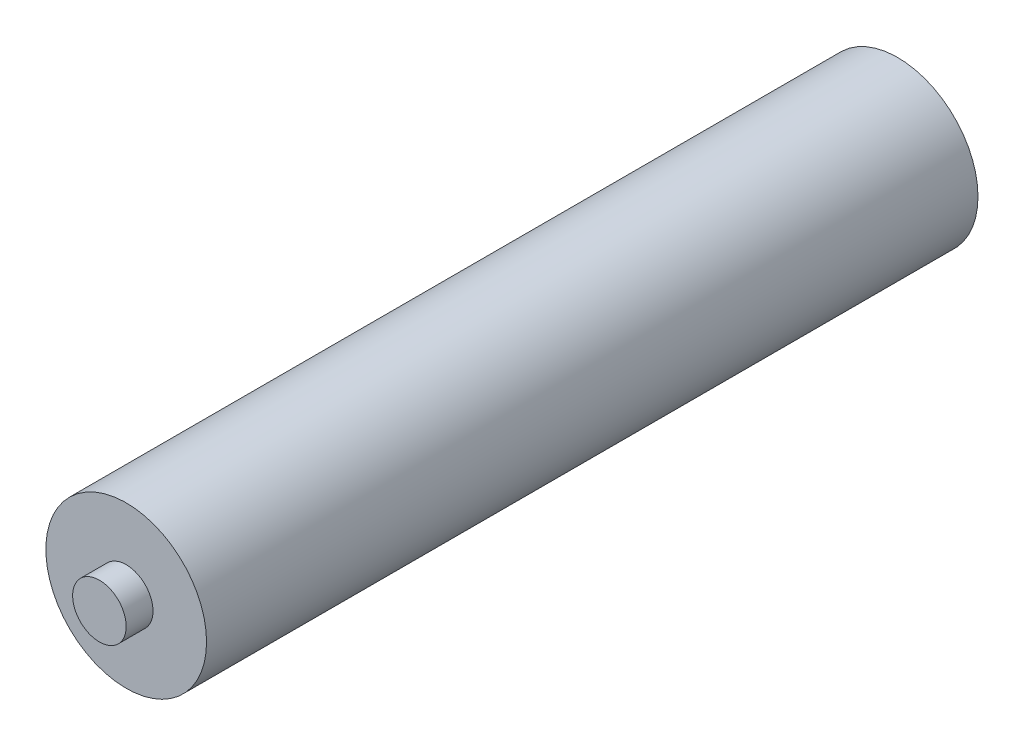
ISO-10303-21;
HEADER;
FILE_DESCRIPTION(('STEP AP214'),'2;1');
FILE_NAME('part.step','',(''),(''),'','','');
FILE_SCHEMA(('AUTOMOTIVE_DESIGN { 1 0 10303 214 1 1 1 1 }'));
ENDSEC;
DATA;
#1=APPLICATION_CONTEXT('core data for automotive mechanical design processes');
#2=APPLICATION_PROTOCOL_DEFINITION('international standard','automotive_design',2000,#1);
#3=PRODUCT_CONTEXT('',#1,'mechanical');
#4=PRODUCT('Part','Part','',(#3));
#5=PRODUCT_RELATED_PRODUCT_CATEGORY('part','',(#4));
#6=PRODUCT_DEFINITION_FORMATION('','',#4);
#7=PRODUCT_DEFINITION_CONTEXT('part definition',#1,'design');
#8=PRODUCT_DEFINITION('design','',#6,#7);
#9=PRODUCT_DEFINITION_SHAPE('','',#8);
#10=(LENGTH_UNIT() NAMED_UNIT(*) SI_UNIT(.MILLI.,.METRE.));
#11=(NAMED_UNIT(*) PLANE_ANGLE_UNIT() SI_UNIT($,.RADIAN.));
#12=(NAMED_UNIT(*) SI_UNIT($,.STERADIAN.) SOLID_ANGLE_UNIT());
#13=UNCERTAINTY_MEASURE_WITH_UNIT(LENGTH_MEASURE(1.E-05),#10,'distance_accuracy_value','');
#14=(GEOMETRIC_REPRESENTATION_CONTEXT(3) GLOBAL_UNCERTAINTY_ASSIGNED_CONTEXT((#13)) GLOBAL_UNIT_ASSIGNED_CONTEXT((#10,
#11,#12)) REPRESENTATION_CONTEXT('',''));
#15=CARTESIAN_POINT('',(0.,0.,0.));
#16=DIRECTION('',(0.,0.,1.));
#17=DIRECTION('',(1.,0.,0.));
#18=AXIS2_PLACEMENT_3D('',#15,#16,#17);
#19=CARTESIAN_POINT('',(0.,0.,144.));
#20=DIRECTION('',(0.,0.,-1.));
#21=DIRECTION('',(-1.,0.,0.));
#22=AXIS2_PLACEMENT_3D('',#19,#20,#21);
#23=CYLINDRICAL_SURFACE('',#22,15.);
#24=CARTESIAN_POINT('',(0.,0.,144.));
#25=DIRECTION('',(0.,0.,1.));
#26=DIRECTION('',(1.,0.,0.));
#27=AXIS2_PLACEMENT_3D('',#24,#25,#26);
#28=CIRCLE('',#27,15.);
#29=CARTESIAN_POINT('',(15.,0.,144.));
#30=VERTEX_POINT('',#29);
#31=EDGE_CURVE('E49',#30,#30,#28,.T.);
#32=ORIENTED_EDGE('',*,*,#31,.F.);
#33=EDGE_LOOP('',(#32));
#34=FACE_BOUND('',#33,.T.);
#35=CARTESIAN_POINT('',(0.,0.,0.));
#36=DIRECTION('',(0.,0.,1.));
#37=DIRECTION('',(1.,0.,0.));
#38=AXIS2_PLACEMENT_3D('',#35,#36,#37);
#39=CIRCLE('',#38,15.);
#40=CARTESIAN_POINT('',(15.,0.,0.));
#41=VERTEX_POINT('',#40);
#42=EDGE_CURVE('E40',#41,#41,#39,.T.);
#43=ORIENTED_EDGE('',*,*,#42,.T.);
#44=EDGE_LOOP('',(#43));
#45=FACE_BOUND('',#44,.T.);
#46=ADVANCED_FACE('F37',(#34,#45),#23,.T.);
#47=CARTESIAN_POINT('',(0.,0.,144.));
#48=DIRECTION('',(0.,0.,1.));
#49=DIRECTION('',(1.,0.,0.));
#50=AXIS2_PLACEMENT_3D('',#47,#48,#49);
#51=PLANE('',#50);
#52=CARTESIAN_POINT('',(0.,0.,144.));
#53=DIRECTION('',(0.,0.,1.));
#54=DIRECTION('',(1.,0.,0.));
#55=AXIS2_PLACEMENT_3D('',#52,#53,#54);
#56=CIRCLE('',#55,5.);
#57=CARTESIAN_POINT('',(5.,0.,144.));
#58=VERTEX_POINT('',#57);
#59=EDGE_CURVE('E44',#58,#58,#56,.T.);
#60=ORIENTED_EDGE('',*,*,#59,.F.);
#61=EDGE_LOOP('',(#60));
#62=FACE_BOUND('',#61,.T.);
#63=ORIENTED_EDGE('',*,*,#31,.T.);
#64=EDGE_LOOP('',(#63));
#65=FACE_BOUND('',#64,.T.);
#66=ADVANCED_FACE('F66',(#62,#65),#51,.T.);
#67=CARTESIAN_POINT('',(0.,0.,0.));
#68=DIRECTION('',(0.,0.,1.));
#69=DIRECTION('',(1.,0.,0.));
#70=AXIS2_PLACEMENT_3D('',#67,#68,#69);
#71=PLANE('',#70);
#72=CARTESIAN_POINT('',(0.,0.,0.));
#73=DIRECTION('',(0.,0.,-1.));
#74=DIRECTION('',(-1.,0.,0.));
#75=AXIS2_PLACEMENT_3D('',#72,#73,#74);
#76=CIRCLE('',#75,5.);
#77=CARTESIAN_POINT('',(-5.,0.,0.));
#78=VERTEX_POINT('',#77);
#79=EDGE_CURVE('E10',#78,#78,#76,.T.);
#80=ORIENTED_EDGE('',*,*,#79,.F.);
#81=EDGE_LOOP('',(#80));
#82=FACE_BOUND('',#81,.T.);
#83=ORIENTED_EDGE('',*,*,#42,.F.);
#84=EDGE_LOOP('',(#83));
#85=FACE_BOUND('',#84,.T.);
#86=ADVANCED_FACE('F63',(#82,#85),#71,.F.);
#87=CARTESIAN_POINT('',(0.,0.,149.));
#88=DIRECTION('',(0.,0.,-1.));
#89=DIRECTION('',(-1.,0.,0.));
#90=AXIS2_PLACEMENT_3D('',#87,#88,#89);
#91=CYLINDRICAL_SURFACE('',#90,5.);
#92=CARTESIAN_POINT('',(0.,0.,149.));
#93=DIRECTION('',(0.,0.,1.));
#94=DIRECTION('',(1.,0.,0.));
#95=AXIS2_PLACEMENT_3D('',#92,#93,#94);
#96=CIRCLE('',#95,5.);
#97=CARTESIAN_POINT('',(5.,0.,149.));
#98=VERTEX_POINT('',#97);
#99=EDGE_CURVE('E54',#98,#98,#96,.T.);
#100=ORIENTED_EDGE('',*,*,#99,.F.);
#101=EDGE_LOOP('',(#100));
#102=FACE_BOUND('',#101,.T.);
#103=ORIENTED_EDGE('',*,*,#59,.T.);
#104=EDGE_LOOP('',(#103));
#105=FACE_BOUND('',#104,.T.);
#106=ADVANCED_FACE('F65',(#102,#105),#91,.T.);
#107=CARTESIAN_POINT('',(0.,0.,149.));
#108=DIRECTION('',(0.,0.,1.));
#109=DIRECTION('',(1.,0.,0.));
#110=AXIS2_PLACEMENT_3D('',#107,#108,#109);
#111=PLANE('',#110);
#112=ORIENTED_EDGE('',*,*,#99,.T.);
#113=EDGE_LOOP('',(#112));
#114=FACE_BOUND('',#113,.T.);
#115=ADVANCED_FACE('F73',(#114),#111,.T.);
#116=CARTESIAN_POINT('',(0.,0.,-5.));
#117=DIRECTION('',(0.,0.,1.));
#118=DIRECTION('',(1.,0.,0.));
#119=AXIS2_PLACEMENT_3D('',#116,#117,#118);
#120=CYLINDRICAL_SURFACE('',#119,5.);
#121=CARTESIAN_POINT('',(0.,0.,-5.));
#122=DIRECTION('',(0.,0.,-1.));
#123=DIRECTION('',(-1.,0.,0.));
#124=AXIS2_PLACEMENT_3D('',#121,#122,#123);
#125=CIRCLE('',#124,5.);
#126=CARTESIAN_POINT('',(-5.,0.,-5.));
#127=VERTEX_POINT('',#126);
#128=EDGE_CURVE('E53',#127,#127,#125,.T.);
#129=ORIENTED_EDGE('',*,*,#128,.F.);
#130=EDGE_LOOP('',(#129));
#131=FACE_BOUND('',#130,.T.);
#132=ORIENTED_EDGE('',*,*,#79,.T.);
#133=EDGE_LOOP('',(#132));
#134=FACE_BOUND('',#133,.T.);
#135=ADVANCED_FACE('F98',(#131,#134),#120,.T.);
#136=CARTESIAN_POINT('',(0.,0.,-5.));
#137=DIRECTION('',(0.,0.,-1.));
#138=DIRECTION('',(-1.,0.,0.));
#139=AXIS2_PLACEMENT_3D('',#136,#137,#138);
#140=PLANE('',#139);
#141=ORIENTED_EDGE('',*,*,#128,.T.);
#142=EDGE_LOOP('',(#141));
#143=FACE_BOUND('',#142,.T.);
#144=ADVANCED_FACE('F110',(#143),#140,.T.);
#145=CLOSED_SHELL('',(#46,#66,#86,#106,#115,#135,#144));
#146=MANIFOLD_SOLID_BREP('B2',#145);
#147=ADVANCED_BREP_SHAPE_REPRESENTATION('',(#18,#146),#14);
#148=SHAPE_DEFINITION_REPRESENTATION(#9,#147);
ENDSEC;
END-ISO-10303-21;
